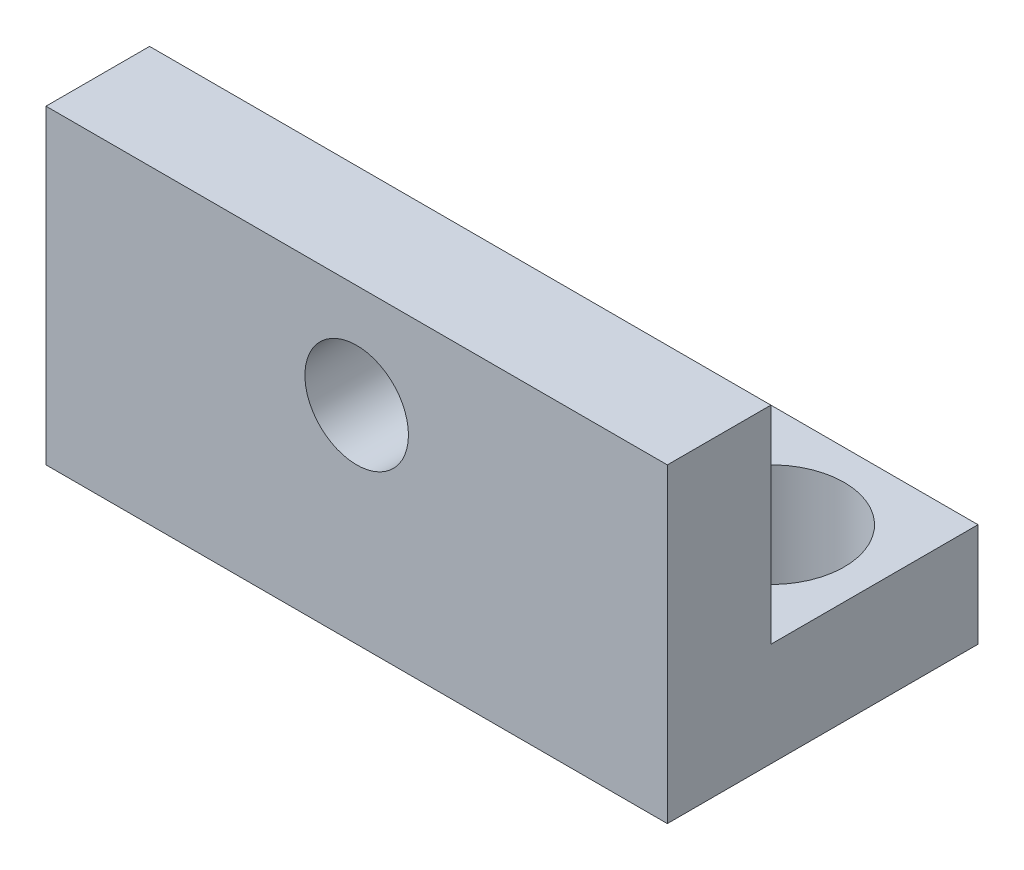
ISO-10303-21;
HEADER;
FILE_DESCRIPTION(('STEP AP214'),'2;1');
FILE_NAME('part.step','',(''),(''),'','','');
FILE_SCHEMA(('AUTOMOTIVE_DESIGN { 1 0 10303 214 1 1 1 1 }'));
ENDSEC;
DATA;
#1=APPLICATION_CONTEXT('core data for automotive mechanical design processes');
#2=APPLICATION_PROTOCOL_DEFINITION('international standard','automotive_design',2000,#1);
#3=PRODUCT_CONTEXT('',#1,'mechanical');
#4=PRODUCT('Part','Part','',(#3));
#5=PRODUCT_RELATED_PRODUCT_CATEGORY('part','',(#4));
#6=PRODUCT_DEFINITION_FORMATION('','',#4);
#7=PRODUCT_DEFINITION_CONTEXT('part definition',#1,'design');
#8=PRODUCT_DEFINITION('design','',#6,#7);
#9=PRODUCT_DEFINITION_SHAPE('','',#8);
#10=(LENGTH_UNIT() NAMED_UNIT(*) SI_UNIT(.MILLI.,.METRE.));
#11=(NAMED_UNIT(*) PLANE_ANGLE_UNIT() SI_UNIT($,.RADIAN.));
#12=(NAMED_UNIT(*) SI_UNIT($,.STERADIAN.) SOLID_ANGLE_UNIT());
#13=UNCERTAINTY_MEASURE_WITH_UNIT(LENGTH_MEASURE(1.E-05),#10,'distance_accuracy_value','');
#14=(GEOMETRIC_REPRESENTATION_CONTEXT(3) GLOBAL_UNCERTAINTY_ASSIGNED_CONTEXT((#13)) GLOBAL_UNIT_ASSIGNED_CONTEXT((#10,
#11,#12)) REPRESENTATION_CONTEXT('',''));
#15=CARTESIAN_POINT('',(0.,0.,0.));
#16=DIRECTION('',(0.,0.,1.));
#17=DIRECTION('',(1.,0.,0.));
#18=AXIS2_PLACEMENT_3D('',#15,#16,#17);
#19=CARTESIAN_POINT('',(0.,0.,3.175));
#20=DIRECTION('',(0.,0.,-1.));
#21=DIRECTION('',(-1.,0.,0.));
#22=AXIS2_PLACEMENT_3D('',#19,#20,#21);
#23=PLANE('',#22);
#24=DIRECTION('',(0.,1.,0.));
#25=VECTOR('',#24,1.);
#26=CARTESIAN_POINT('',(9.525,-3.175,3.175));
#27=LINE('',#26,#25);
#28=CARTESIAN_POINT('',(9.525,-6.35,3.175));
#29=VERTEX_POINT('',#28);
#30=CARTESIAN_POINT('',(9.525,3.175,3.175));
#31=VERTEX_POINT('',#30);
#32=EDGE_CURVE('E95',#29,#31,#27,.T.);
#33=ORIENTED_EDGE('',*,*,#32,.T.);
#34=DIRECTION('',(-1.,0.,0.));
#35=VECTOR('',#34,1.);
#36=CARTESIAN_POINT('',(-9.52500000000001,3.175,3.175));
#37=LINE('',#36,#35);
#38=CARTESIAN_POINT('',(-9.52500000000001,3.175,3.175));
#39=VERTEX_POINT('',#38);
#40=EDGE_CURVE('E57',#31,#39,#37,.T.);
#41=ORIENTED_EDGE('',*,*,#40,.T.);
#42=DIRECTION('',(0.,-1.,0.));
#43=VECTOR('',#42,1.);
#44=CARTESIAN_POINT('',(-9.52500000000001,-3.175,3.175));
#45=LINE('',#44,#43);
#46=CARTESIAN_POINT('',(-9.52500000000001,-6.35,3.175));
#47=VERTEX_POINT('',#46);
#48=EDGE_CURVE('E127',#39,#47,#45,.T.);
#49=ORIENTED_EDGE('',*,*,#48,.T.);
#50=DIRECTION('',(-1.,0.,0.));
#51=VECTOR('',#50,1.);
#52=CARTESIAN_POINT('',(-9.52500000000001,-6.35,3.175));
#53=LINE('',#52,#51);
#54=EDGE_CURVE('E109',#29,#47,#53,.T.);
#55=ORIENTED_EDGE('',*,*,#54,.F.);
#56=EDGE_LOOP('',(#33,#41,#49,#55));
#57=FACE_BOUND('',#56,.T.);
#58=CARTESIAN_POINT('',(0.,0.,3.175));
#59=DIRECTION('',(0.,0.,1.));
#60=DIRECTION('',(1.,0.,0.));
#61=AXIS2_PLACEMENT_3D('',#58,#59,#60);
#62=CIRCLE('',#61,1.5875);
#63=CARTESIAN_POINT('',(1.58749999999999,0.,3.175));
#64=VERTEX_POINT('',#63);
#65=EDGE_CURVE('E120',#64,#64,#62,.T.);
#66=ORIENTED_EDGE('',*,*,#65,.F.);
#67=EDGE_LOOP('',(#66));
#68=FACE_BOUND('',#67,.T.);
#69=ADVANCED_FACE('F40',(#57,#68),#23,.F.);
#70=CARTESIAN_POINT('',(0.,0.,0.));
#71=DIRECTION('',(0.,0.,-1.));
#72=DIRECTION('',(-1.,0.,0.));
#73=AXIS2_PLACEMENT_3D('',#70,#71,#72);
#74=PLANE('',#73);
#75=DIRECTION('',(0.,1.,0.));
#76=VECTOR('',#75,1.);
#77=CARTESIAN_POINT('',(9.525,-3.175,0.));
#78=LINE('',#77,#76);
#79=CARTESIAN_POINT('',(9.525,-3.175,0.));
#80=VERTEX_POINT('',#79);
#81=CARTESIAN_POINT('',(9.525,3.175,0.));
#82=VERTEX_POINT('',#81);
#83=EDGE_CURVE('E91',#80,#82,#78,.T.);
#84=ORIENTED_EDGE('',*,*,#83,.F.);
#85=DIRECTION('',(1.,0.,0.));
#86=VECTOR('',#85,1.);
#87=CARTESIAN_POINT('',(-9.52500000000001,-3.175,0.));
#88=LINE('',#87,#86);
#89=CARTESIAN_POINT('',(-9.52500000000001,-3.175,0.));
#90=VERTEX_POINT('',#89);
#91=EDGE_CURVE('E84',#90,#80,#88,.T.);
#92=ORIENTED_EDGE('',*,*,#91,.F.);
#93=DIRECTION('',(0.,-1.,0.));
#94=VECTOR('',#93,1.);
#95=CARTESIAN_POINT('',(-9.52500000000001,-3.175,0.));
#96=LINE('',#95,#94);
#97=CARTESIAN_POINT('',(-9.52500000000001,3.175,0.));
#98=VERTEX_POINT('',#97);
#99=EDGE_CURVE('E74',#98,#90,#96,.T.);
#100=ORIENTED_EDGE('',*,*,#99,.F.);
#101=DIRECTION('',(-1.,0.,0.));
#102=VECTOR('',#101,1.);
#103=CARTESIAN_POINT('',(-9.52500000000001,3.175,0.));
#104=LINE('',#103,#102);
#105=EDGE_CURVE('E68',#82,#98,#104,.T.);
#106=ORIENTED_EDGE('',*,*,#105,.F.);
#107=EDGE_LOOP('',(#84,#92,#100,#106));
#108=FACE_BOUND('',#107,.T.);
#109=CARTESIAN_POINT('',(0.,0.,0.));
#110=DIRECTION('',(0.,0.,1.));
#111=DIRECTION('',(1.,0.,0.));
#112=AXIS2_PLACEMENT_3D('',#109,#110,#111);
#113=CIRCLE('',#112,1.5875);
#114=CARTESIAN_POINT('',(1.58749999999999,0.,0.));
#115=VERTEX_POINT('',#114);
#116=EDGE_CURVE('E119',#115,#115,#113,.T.);
#117=ORIENTED_EDGE('',*,*,#116,.T.);
#118=EDGE_LOOP('',(#117));
#119=FACE_BOUND('',#118,.T.);
#120=ADVANCED_FACE('F88',(#108,#119),#74,.T.);
#121=CARTESIAN_POINT('',(9.525,-3.175,3.175));
#122=DIRECTION('',(-1.,0.,0.));
#123=DIRECTION('',(0.,0.,1.));
#124=AXIS2_PLACEMENT_3D('',#121,#122,#123);
#125=PLANE('',#124);
#126=ORIENTED_EDGE('',*,*,#83,.T.);
#127=DIRECTION('',(0.,0.,-1.));
#128=VECTOR('',#127,1.);
#129=CARTESIAN_POINT('',(9.525,3.175,3.175));
#130=LINE('',#129,#128);
#131=EDGE_CURVE('E11',#31,#82,#130,.T.);
#132=ORIENTED_EDGE('',*,*,#131,.F.);
#133=ORIENTED_EDGE('',*,*,#32,.F.);
#134=DIRECTION('',(0.,0.,1.));
#135=VECTOR('',#134,1.);
#136=CARTESIAN_POINT('',(9.525,-6.35,3.175));
#137=LINE('',#136,#135);
#138=CARTESIAN_POINT('',(9.525,-6.35,-6.35));
#139=VERTEX_POINT('',#138);
#140=EDGE_CURVE('E155',#139,#29,#137,.T.);
#141=ORIENTED_EDGE('',*,*,#140,.F.);
#142=DIRECTION('',(0.,1.,0.));
#143=VECTOR('',#142,1.);
#144=CARTESIAN_POINT('',(9.525,-6.35,-6.35));
#145=LINE('',#144,#143);
#146=CARTESIAN_POINT('',(9.525,-3.175,-6.35));
#147=VERTEX_POINT('',#146);
#148=EDGE_CURVE('E114',#139,#147,#145,.T.);
#149=ORIENTED_EDGE('',*,*,#148,.T.);
#150=DIRECTION('',(0.,0.,1.));
#151=VECTOR('',#150,1.);
#152=CARTESIAN_POINT('',(9.525,-3.175,3.175));
#153=LINE('',#152,#151);
#154=EDGE_CURVE('E103',#147,#80,#153,.T.);
#155=ORIENTED_EDGE('',*,*,#154,.T.);
#156=EDGE_LOOP('',(#126,#132,#133,#141,#149,#155));
#157=FACE_BOUND('',#156,.T.);
#158=ADVANCED_FACE('F42',(#157),#125,.F.);
#159=CARTESIAN_POINT('',(-9.52500000000001,3.175,3.175));
#160=DIRECTION('',(0.,-1.,0.));
#161=DIRECTION('',(0.,0.,-1.));
#162=AXIS2_PLACEMENT_3D('',#159,#160,#161);
#163=PLANE('',#162);
#164=ORIENTED_EDGE('',*,*,#105,.T.);
#165=DIRECTION('',(0.,0.,-1.));
#166=VECTOR('',#165,1.);
#167=CARTESIAN_POINT('',(-9.52500000000001,3.175,3.175));
#168=LINE('',#167,#166);
#169=EDGE_CURVE('E49',#39,#98,#168,.T.);
#170=ORIENTED_EDGE('',*,*,#169,.F.);
#171=ORIENTED_EDGE('',*,*,#40,.F.);
#172=ORIENTED_EDGE('',*,*,#131,.T.);
#173=EDGE_LOOP('',(#164,#170,#171,#172));
#174=FACE_BOUND('',#173,.T.);
#175=ADVANCED_FACE('F205',(#174),#163,.F.);
#176=CARTESIAN_POINT('',(-9.52500000000001,-3.175,3.175));
#177=DIRECTION('',(1.,0.,0.));
#178=DIRECTION('',(0.,0.,-1.));
#179=AXIS2_PLACEMENT_3D('',#176,#177,#178);
#180=PLANE('',#179);
#181=ORIENTED_EDGE('',*,*,#99,.T.);
#182=DIRECTION('',(0.,0.,-1.));
#183=VECTOR('',#182,1.);
#184=CARTESIAN_POINT('',(-9.52500000000001,-3.175,3.175));
#185=LINE('',#184,#183);
#186=CARTESIAN_POINT('',(-9.525,-3.175,-6.35));
#187=VERTEX_POINT('',#186);
#188=EDGE_CURVE('E80',#90,#187,#185,.T.);
#189=ORIENTED_EDGE('',*,*,#188,.T.);
#190=DIRECTION('',(0.,1.,0.));
#191=VECTOR('',#190,1.);
#192=CARTESIAN_POINT('',(-9.525,-6.35,-6.35));
#193=LINE('',#192,#191);
#194=CARTESIAN_POINT('',(-9.525,-6.35,-6.35));
#195=VERTEX_POINT('',#194);
#196=EDGE_CURVE('E117',#195,#187,#193,.T.);
#197=ORIENTED_EDGE('',*,*,#196,.F.);
#198=DIRECTION('',(0.,0.,-1.));
#199=VECTOR('',#198,1.);
#200=CARTESIAN_POINT('',(-9.52500000000001,-6.35,3.175));
#201=LINE('',#200,#199);
#202=EDGE_CURVE('E113',#47,#195,#201,.T.);
#203=ORIENTED_EDGE('',*,*,#202,.F.);
#204=ORIENTED_EDGE('',*,*,#48,.F.);
#205=ORIENTED_EDGE('',*,*,#169,.T.);
#206=EDGE_LOOP('',(#181,#189,#197,#203,#204,#205));
#207=FACE_BOUND('',#206,.T.);
#208=ADVANCED_FACE('F76',(#207),#180,.F.);
#209=CARTESIAN_POINT('',(0.,0.,3.175));
#210=DIRECTION('',(0.,0.,-1.));
#211=DIRECTION('',(-1.,0.,0.));
#212=AXIS2_PLACEMENT_3D('',#209,#210,#211);
#213=CYLINDRICAL_SURFACE('',#212,1.5875);
#214=ORIENTED_EDGE('',*,*,#65,.T.);
#215=EDGE_LOOP('',(#214));
#216=FACE_BOUND('',#215,.T.);
#217=ORIENTED_EDGE('',*,*,#116,.F.);
#218=EDGE_LOOP('',(#217));
#219=FACE_BOUND('',#218,.T.);
#220=ADVANCED_FACE('F186',(#216,#219),#213,.F.);
#221=CARTESIAN_POINT('',(0.,-3.175,0.));
#222=DIRECTION('',(0.,-1.,0.));
#223=DIRECTION('',(0.,0.,-1.));
#224=AXIS2_PLACEMENT_3D('',#221,#222,#223);
#225=PLANE('',#224);
#226=CARTESIAN_POINT('',(-6.35,-3.175,-3.175));
#227=DIRECTION('',(0.,-1.,0.));
#228=DIRECTION('',(0.,0.,-1.));
#229=AXIS2_PLACEMENT_3D('',#226,#227,#228);
#230=CIRCLE('',#229,2.2479);
#231=CARTESIAN_POINT('',(-6.35,-3.175,-5.4229));
#232=VERTEX_POINT('',#231);
#233=EDGE_CURVE('E164',#232,#232,#230,.T.);
#234=ORIENTED_EDGE('',*,*,#233,.T.);
#235=EDGE_LOOP('',(#234));
#236=FACE_BOUND('',#235,.T.);
#237=CARTESIAN_POINT('',(6.35,-3.175,-3.175));
#238=DIRECTION('',(0.,-1.,0.));
#239=DIRECTION('',(0.,0.,-1.));
#240=AXIS2_PLACEMENT_3D('',#237,#238,#239);
#241=CIRCLE('',#240,2.2479);
#242=CARTESIAN_POINT('',(6.35,-3.175,-5.4229));
#243=VERTEX_POINT('',#242);
#244=EDGE_CURVE('E101',#243,#243,#241,.T.);
#245=ORIENTED_EDGE('',*,*,#244,.T.);
#246=EDGE_LOOP('',(#245));
#247=FACE_BOUND('',#246,.T.);
#248=ORIENTED_EDGE('',*,*,#188,.F.);
#249=ORIENTED_EDGE('',*,*,#91,.T.);
#250=ORIENTED_EDGE('',*,*,#154,.F.);
#251=DIRECTION('',(1.,0.,0.));
#252=VECTOR('',#251,1.);
#253=CARTESIAN_POINT('',(-9.525,-3.175,-6.35));
#254=LINE('',#253,#252);
#255=EDGE_CURVE('E99',#187,#147,#254,.T.);
#256=ORIENTED_EDGE('',*,*,#255,.F.);
#257=EDGE_LOOP('',(#248,#249,#250,#256));
#258=FACE_BOUND('',#257,.T.);
#259=ADVANCED_FACE('F97',(#236,#247,#258),#225,.F.);
#260=CARTESIAN_POINT('',(-9.525,-6.35,-6.35));
#261=DIRECTION('',(0.,0.,1.));
#262=DIRECTION('',(1.,0.,0.));
#263=AXIS2_PLACEMENT_3D('',#260,#261,#262);
#264=PLANE('',#263);
#265=ORIENTED_EDGE('',*,*,#255,.T.);
#266=ORIENTED_EDGE('',*,*,#148,.F.);
#267=DIRECTION('',(1.,0.,0.));
#268=VECTOR('',#267,1.);
#269=CARTESIAN_POINT('',(-9.525,-6.35,-6.35));
#270=LINE('',#269,#268);
#271=EDGE_CURVE('E152',#195,#139,#270,.T.);
#272=ORIENTED_EDGE('',*,*,#271,.F.);
#273=ORIENTED_EDGE('',*,*,#196,.T.);
#274=EDGE_LOOP('',(#265,#266,#272,#273));
#275=FACE_BOUND('',#274,.T.);
#276=ADVANCED_FACE('F159',(#275),#264,.F.);
#277=CARTESIAN_POINT('',(0.,-6.35,0.));
#278=DIRECTION('',(0.,-1.,0.));
#279=DIRECTION('',(0.,0.,-1.));
#280=AXIS2_PLACEMENT_3D('',#277,#278,#279);
#281=PLANE('',#280);
#282=CARTESIAN_POINT('',(-6.35,-6.35,-3.175));
#283=DIRECTION('',(0.,-1.,0.));
#284=DIRECTION('',(0.,0.,-1.));
#285=AXIS2_PLACEMENT_3D('',#282,#283,#284);
#286=CIRCLE('',#285,2.2479);
#287=CARTESIAN_POINT('',(-6.35,-6.35,-5.4229));
#288=VERTEX_POINT('',#287);
#289=EDGE_CURVE('E167',#288,#288,#286,.T.);
#290=ORIENTED_EDGE('',*,*,#289,.F.);
#291=EDGE_LOOP('',(#290));
#292=FACE_BOUND('',#291,.T.);
#293=CARTESIAN_POINT('',(6.35,-6.35,-3.175));
#294=DIRECTION('',(0.,-1.,0.));
#295=DIRECTION('',(0.,0.,-1.));
#296=AXIS2_PLACEMENT_3D('',#293,#294,#295);
#297=CIRCLE('',#296,2.2479);
#298=CARTESIAN_POINT('',(6.35,-6.35,-5.4229));
#299=VERTEX_POINT('',#298);
#300=EDGE_CURVE('E106',#299,#299,#297,.T.);
#301=ORIENTED_EDGE('',*,*,#300,.F.);
#302=EDGE_LOOP('',(#301));
#303=FACE_BOUND('',#302,.T.);
#304=ORIENTED_EDGE('',*,*,#202,.T.);
#305=ORIENTED_EDGE('',*,*,#271,.T.);
#306=ORIENTED_EDGE('',*,*,#140,.T.);
#307=ORIENTED_EDGE('',*,*,#54,.T.);
#308=EDGE_LOOP('',(#304,#305,#306,#307));
#309=FACE_BOUND('',#308,.T.);
#310=ADVANCED_FACE('F153',(#292,#303,#309),#281,.T.);
#311=CARTESIAN_POINT('',(6.35,-6.35,-3.175));
#312=DIRECTION('',(0.,-1.,0.));
#313=DIRECTION('',(0.,0.,-1.));
#314=AXIS2_PLACEMENT_3D('',#311,#312,#313);
#315=CYLINDRICAL_SURFACE('',#314,2.2479);
#316=ORIENTED_EDGE('',*,*,#300,.T.);
#317=EDGE_LOOP('',(#316));
#318=FACE_BOUND('',#317,.T.);
#319=ORIENTED_EDGE('',*,*,#244,.F.);
#320=EDGE_LOOP('',(#319));
#321=FACE_BOUND('',#320,.T.);
#322=ADVANCED_FACE('F176',(#318,#321),#315,.F.);
#323=CARTESIAN_POINT('',(-6.35,-6.35,-3.175));
#324=DIRECTION('',(0.,-1.,0.));
#325=DIRECTION('',(0.,0.,-1.));
#326=AXIS2_PLACEMENT_3D('',#323,#324,#325);
#327=CYLINDRICAL_SURFACE('',#326,2.2479);
#328=ORIENTED_EDGE('',*,*,#289,.T.);
#329=EDGE_LOOP('',(#328));
#330=FACE_BOUND('',#329,.T.);
#331=ORIENTED_EDGE('',*,*,#233,.F.);
#332=EDGE_LOOP('',(#331));
#333=FACE_BOUND('',#332,.T.);
#334=ADVANCED_FACE('F171',(#330,#333),#327,.F.);
#335=CLOSED_SHELL('',(#69,#120,#158,#175,#208,#220,#259,#276,#310,#322,#334));
#336=MANIFOLD_SOLID_BREP('B2',#335);
#337=ADVANCED_BREP_SHAPE_REPRESENTATION('',(#18,#336),#14);
#338=SHAPE_DEFINITION_REPRESENTATION(#9,#337);
ENDSEC;
END-ISO-10303-21;
